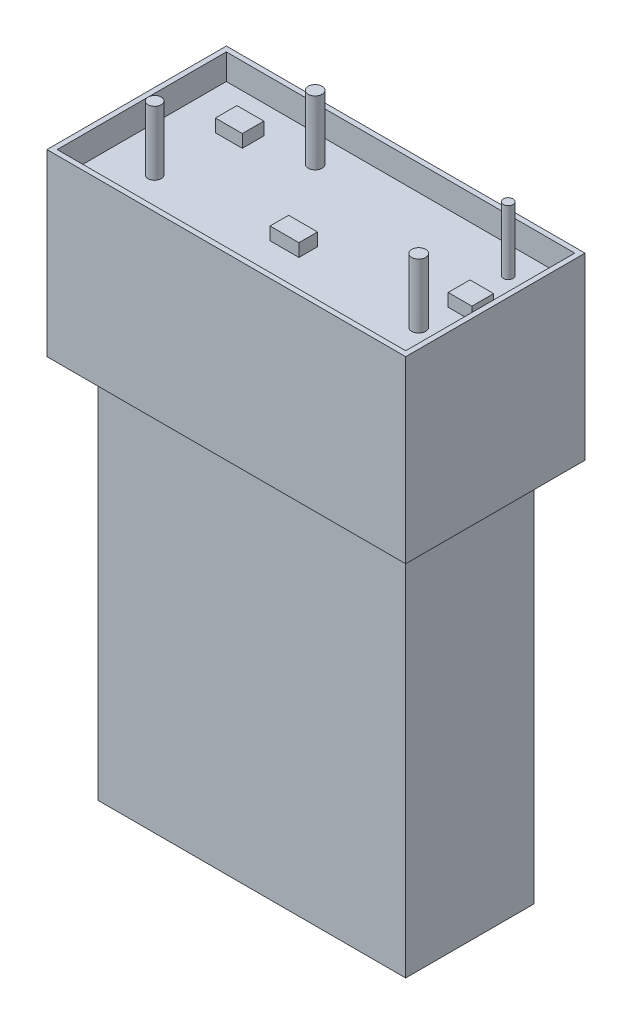
ISO-10303-21;
HEADER;
FILE_DESCRIPTION(('STEP AP214'),'2;1');
FILE_NAME('part.step','',(''),(''),'','','');
FILE_SCHEMA(('AUTOMOTIVE_DESIGN { 1 0 10303 214 1 1 1 1 }'));
ENDSEC;
DATA;
#1=APPLICATION_CONTEXT('core data for automotive mechanical design processes');
#2=APPLICATION_PROTOCOL_DEFINITION('international standard','automotive_design',2000,#1);
#3=PRODUCT_CONTEXT('',#1,'mechanical');
#4=PRODUCT('Part','Part','',(#3));
#5=PRODUCT_RELATED_PRODUCT_CATEGORY('part','',(#4));
#6=PRODUCT_DEFINITION_FORMATION('','',#4);
#7=PRODUCT_DEFINITION_CONTEXT('part definition',#1,'design');
#8=PRODUCT_DEFINITION('design','',#6,#7);
#9=PRODUCT_DEFINITION_SHAPE('','',#8);
#10=(LENGTH_UNIT() NAMED_UNIT(*) SI_UNIT(.MILLI.,.METRE.));
#11=(NAMED_UNIT(*) PLANE_ANGLE_UNIT() SI_UNIT($,.RADIAN.));
#12=(NAMED_UNIT(*) SI_UNIT($,.STERADIAN.) SOLID_ANGLE_UNIT());
#13=UNCERTAINTY_MEASURE_WITH_UNIT(LENGTH_MEASURE(1.E-05),#10,'distance_accuracy_value','');
#14=(GEOMETRIC_REPRESENTATION_CONTEXT(3) GLOBAL_UNCERTAINTY_ASSIGNED_CONTEXT((#13)) GLOBAL_UNIT_ASSIGNED_CONTEXT((#10,
#11,#12)) REPRESENTATION_CONTEXT('',''));
#15=CARTESIAN_POINT('',(0.,0.,0.));
#16=DIRECTION('',(0.,0.,1.));
#17=DIRECTION('',(1.,0.,0.));
#18=AXIS2_PLACEMENT_3D('',#15,#16,#17);
#19=CARTESIAN_POINT('',(0.,21000.,0.));
#20=DIRECTION('',(0.,-1.,0.));
#21=DIRECTION('',(0.,0.,-1.));
#22=AXIS2_PLACEMENT_3D('',#19,#20,#21);
#23=PLANE('',#22);
#24=CARTESIAN_POINT('',(5262.84869807051,21000.,-2238.37319331517));
#25=DIRECTION('',(0.,-1.,0.));
#26=DIRECTION('',(0.,0.,-1.));
#27=AXIS2_PLACEMENT_3D('',#24,#25,#26);
#28=CIRCLE('',#27,190.949540720074);
#29=CARTESIAN_POINT('',(5262.84869807051,21000.,-2429.32273403524));
#30=VERTEX_POINT('',#29);
#31=EDGE_CURVE('E11',#30,#30,#28,.F.);
#32=ORIENTED_EDGE('',*,*,#31,.F.);
#33=EDGE_LOOP('',(#32));
#34=FACE_BOUND('',#33,.T.);
#35=CARTESIAN_POINT('',(-5042.3580880572,21000.,1254.61241268812));
#36=DIRECTION('',(0.,-1.,0.));
#37=DIRECTION('',(0.,0.,-1.));
#38=AXIS2_PLACEMENT_3D('',#35,#36,#37);
#39=CIRCLE('',#38,258.07228782179);
#40=CARTESIAN_POINT('',(-5042.3580880572,21000.,996.540124866329));
#41=VERTEX_POINT('',#40);
#42=EDGE_CURVE('E53',#41,#41,#39,.F.);
#43=ORIENTED_EDGE('',*,*,#42,.F.);
#44=EDGE_LOOP('',(#43));
#45=FACE_BOUND('',#44,.T.);
#46=CARTESIAN_POINT('',(5262.84869807051,21000.,1254.61241268812));
#47=DIRECTION('',(0.,-1.,0.));
#48=DIRECTION('',(0.,0.,-1.));
#49=AXIS2_PLACEMENT_3D('',#46,#47,#48);
#50=CIRCLE('',#49,273.548394489378);
#51=CARTESIAN_POINT('',(5262.84869807051,21000.,981.06401819874));
#52=VERTEX_POINT('',#51);
#53=EDGE_CURVE('E463',#52,#52,#50,.F.);
#54=ORIENTED_EDGE('',*,*,#53,.F.);
#55=EDGE_LOOP('',(#54));
#56=FACE_BOUND('',#55,.T.);
#57=CARTESIAN_POINT('',(-2270.0955849557,21000.,-2238.37319331517));
#58=DIRECTION('',(0.,-1.,0.));
#59=DIRECTION('',(0.,0.,-1.));
#60=AXIS2_PLACEMENT_3D('',#57,#58,#59);
#61=CIRCLE('',#60,271.931197035947);
#62=CARTESIAN_POINT('',(-2270.0955849557,21000.,-2510.30439035112));
#63=VERTEX_POINT('',#62);
#64=EDGE_CURVE('E459',#63,#63,#61,.F.);
#65=ORIENTED_EDGE('',*,*,#64,.F.);
#66=EDGE_LOOP('',(#65));
#67=FACE_BOUND('',#66,.T.);
#68=DIRECTION('',(0.,0.,-1.));
#69=VECTOR('',#68,1.);
#70=CARTESIAN_POINT('',(563.939198015646,21000.,505.063160077611));
#71=LINE('',#70,#69);
#72=CARTESIAN_POINT('',(563.939198015646,21000.,1230.26393452562));
#73=VERTEX_POINT('',#72);
#74=CARTESIAN_POINT('',(563.939198015646,21000.,505.063160077611));
#75=VERTEX_POINT('',#74);
#76=EDGE_CURVE('E230',#73,#75,#71,.T.);
#77=ORIENTED_EDGE('',*,*,#76,.F.);
#78=DIRECTION('',(1.,0.,0.));
#79=VECTOR('',#78,1.);
#80=CARTESIAN_POINT('',(-563.939198015646,21000.,1230.26393452562));
#81=LINE('',#80,#79);
#82=CARTESIAN_POINT('',(-563.939198015646,21000.,1230.26393452562));
#83=VERTEX_POINT('',#82);
#84=EDGE_CURVE('E248',#83,#73,#81,.T.);
#85=ORIENTED_EDGE('',*,*,#84,.F.);
#86=DIRECTION('',(0.,0.,1.));
#87=VECTOR('',#86,1.);
#88=CARTESIAN_POINT('',(-563.939198015646,21000.,505.063160077611));
#89=LINE('',#88,#87);
#90=CARTESIAN_POINT('',(-563.939198015646,21000.,505.063160077611));
#91=VERTEX_POINT('',#90);
#92=EDGE_CURVE('E261',#91,#83,#89,.T.);
#93=ORIENTED_EDGE('',*,*,#92,.F.);
#94=DIRECTION('',(-1.,0.,0.));
#95=VECTOR('',#94,1.);
#96=CARTESIAN_POINT('',(-563.939198015646,21000.,505.063160077611));
#97=LINE('',#96,#95);
#98=EDGE_CURVE('E236',#75,#91,#97,.T.);
#99=ORIENTED_EDGE('',*,*,#98,.F.);
#100=EDGE_LOOP('',(#77,#85,#93,#99));
#101=FACE_BOUND('',#100,.T.);
#102=DIRECTION('',(0.,0.,1.));
#103=VECTOR('',#102,1.);
#104=CARTESIAN_POINT('',(-6800.,21000.,-3300.));
#105=LINE('',#104,#103);
#106=CARTESIAN_POINT('',(-6800.,21000.,-3300.));
#107=VERTEX_POINT('',#106);
#108=CARTESIAN_POINT('',(-6800.,21000.,3300.));
#109=VERTEX_POINT('',#108);
#110=EDGE_CURVE('E332',#107,#109,#105,.T.);
#111=ORIENTED_EDGE('',*,*,#110,.T.);
#112=DIRECTION('',(1.,0.,0.));
#113=VECTOR('',#112,1.);
#114=CARTESIAN_POINT('',(-6800.,21000.,3300.));
#115=LINE('',#114,#113);
#116=CARTESIAN_POINT('',(6800.,21000.,3300.));
#117=VERTEX_POINT('',#116);
#118=EDGE_CURVE('E327',#109,#117,#115,.T.);
#119=ORIENTED_EDGE('',*,*,#118,.T.);
#120=DIRECTION('',(0.,0.,-1.));
#121=VECTOR('',#120,1.);
#122=CARTESIAN_POINT('',(6800.,21000.,3300.));
#123=LINE('',#122,#121);
#124=CARTESIAN_POINT('',(6800.,21000.,-3300.));
#125=VERTEX_POINT('',#124);
#126=EDGE_CURVE('E346',#117,#125,#123,.T.);
#127=ORIENTED_EDGE('',*,*,#126,.T.);
#128=DIRECTION('',(-1.,0.,0.));
#129=VECTOR('',#128,1.);
#130=CARTESIAN_POINT('',(6800.,21000.,-3300.));
#131=LINE('',#130,#129);
#132=EDGE_CURVE('E350',#125,#107,#131,.T.);
#133=ORIENTED_EDGE('',*,*,#132,.T.);
#134=EDGE_LOOP('',(#111,#119,#127,#133));
#135=FACE_BOUND('',#134,.T.);
#136=DIRECTION('',(0.,0.,-1.));
#137=VECTOR('',#136,1.);
#138=CARTESIAN_POINT('',(-4229.1920789657,21000.,-1353.44284093981));
#139=LINE('',#138,#137);
#140=CARTESIAN_POINT('',(-4229.1920789657,21000.,-1353.44284093981));
#141=VERTEX_POINT('',#140);
#142=CARTESIAN_POINT('',(-4229.1920789657,21000.,-2193.66277148333));
#143=VERTEX_POINT('',#142);
#144=EDGE_CURVE('E283',#141,#143,#139,.T.);
#145=ORIENTED_EDGE('',*,*,#144,.F.);
#146=DIRECTION('',(1.,0.,0.));
#147=VECTOR('',#146,1.);
#148=CARTESIAN_POINT('',(-5279.16117752801,21000.,-1353.44284093981));
#149=LINE('',#148,#147);
#150=CARTESIAN_POINT('',(-5279.16117752801,21000.,-1353.44284093981));
#151=VERTEX_POINT('',#150);
#152=EDGE_CURVE('E289',#151,#141,#149,.T.);
#153=ORIENTED_EDGE('',*,*,#152,.F.);
#154=DIRECTION('',(0.,0.,1.));
#155=VECTOR('',#154,1.);
#156=CARTESIAN_POINT('',(-5279.16117752801,21000.,-1353.44284093981));
#157=LINE('',#156,#155);
#158=CARTESIAN_POINT('',(-5279.16117752801,21000.,-2193.66277148333));
#159=VERTEX_POINT('',#158);
#160=EDGE_CURVE('E305',#159,#151,#157,.T.);
#161=ORIENTED_EDGE('',*,*,#160,.F.);
#162=DIRECTION('',(-1.,0.,0.));
#163=VECTOR('',#162,1.);
#164=CARTESIAN_POINT('',(-5279.16117752801,21000.,-2193.66277148333));
#165=LINE('',#164,#163);
#166=EDGE_CURVE('E301',#143,#159,#165,.T.);
#167=ORIENTED_EDGE('',*,*,#166,.F.);
#168=EDGE_LOOP('',(#145,#153,#161,#167));
#169=FACE_BOUND('',#168,.T.);
#170=DIRECTION('',(0.,0.,-1.));
#171=VECTOR('',#170,1.);
#172=CARTESIAN_POINT('',(6083.93766020623,21000.,-848.717356223801));
#173=LINE('',#172,#171);
#174=CARTESIAN_POINT('',(6083.93766020623,21000.,0.));
#175=VERTEX_POINT('',#174);
#176=CARTESIAN_POINT('',(6083.93766020623,21000.,-848.717356223801));
#177=VERTEX_POINT('',#176);
#178=EDGE_CURVE('E228',#175,#177,#173,.T.);
#179=ORIENTED_EDGE('',*,*,#178,.F.);
#180=DIRECTION('',(1.,0.,0.));
#181=VECTOR('',#180,1.);
#182=CARTESIAN_POINT('',(5159.11003284151,21000.,0.));
#183=LINE('',#182,#181);
#184=CARTESIAN_POINT('',(5159.11003284151,21000.,0.));
#185=VERTEX_POINT('',#184);
#186=EDGE_CURVE('E225',#185,#175,#183,.T.);
#187=ORIENTED_EDGE('',*,*,#186,.F.);
#188=DIRECTION('',(0.,0.,1.));
#189=VECTOR('',#188,1.);
#190=CARTESIAN_POINT('',(5159.11003284151,21000.,-848.717356223801));
#191=LINE('',#190,#189);
#192=CARTESIAN_POINT('',(5159.11003284151,21000.,-848.717356223801));
#193=VERTEX_POINT('',#192);
#194=EDGE_CURVE('E65',#193,#185,#191,.T.);
#195=ORIENTED_EDGE('',*,*,#194,.F.);
#196=DIRECTION('',(-1.,0.,0.));
#197=VECTOR('',#196,1.);
#198=CARTESIAN_POINT('',(5159.11003284151,21000.,-848.717356223801));
#199=LINE('',#198,#197);
#200=EDGE_CURVE('E60',#177,#193,#199,.T.);
#201=ORIENTED_EDGE('',*,*,#200,.F.);
#202=EDGE_LOOP('',(#179,#187,#195,#201));
#203=FACE_BOUND('',#202,.T.);
#204=ADVANCED_FACE('F44',(#34,#45,#56,#67,#101,#135,#169,#203),#23,.F.);
#205=CARTESIAN_POINT('',(6000.,15000.,2500.));
#206=DIRECTION('',(-1.,0.,0.));
#207=DIRECTION('',(0.,0.,1.));
#208=AXIS2_PLACEMENT_3D('',#205,#206,#207);
#209=PLANE('',#208);
#210=DIRECTION('',(0.,0.,-1.));
#211=VECTOR('',#210,1.);
#212=CARTESIAN_POINT('',(6000.,0.,2500.));
#213=LINE('',#212,#211);
#214=CARTESIAN_POINT('',(6000.,0.,2500.));
#215=VERTEX_POINT('',#214);
#216=CARTESIAN_POINT('',(6000.,0.,-2500.));
#217=VERTEX_POINT('',#216);
#218=EDGE_CURVE('E414',#215,#217,#213,.T.);
#219=ORIENTED_EDGE('',*,*,#218,.T.);
#220=DIRECTION('',(0.,-1.,0.));
#221=VECTOR('',#220,1.);
#222=CARTESIAN_POINT('',(6000.,15000.,-2500.));
#223=LINE('',#222,#221);
#224=CARTESIAN_POINT('',(6000.,15000.,-2500.));
#225=VERTEX_POINT('',#224);
#226=EDGE_CURVE('E455',#225,#217,#223,.T.);
#227=ORIENTED_EDGE('',*,*,#226,.F.);
#228=DIRECTION('',(0.,0.,-1.));
#229=VECTOR('',#228,1.);
#230=CARTESIAN_POINT('',(6000.,15000.,2500.));
#231=LINE('',#230,#229);
#232=CARTESIAN_POINT('',(6000.,15000.,2500.));
#233=VERTEX_POINT('',#232);
#234=EDGE_CURVE('E415',#233,#225,#231,.T.);
#235=ORIENTED_EDGE('',*,*,#234,.F.);
#236=DIRECTION('',(0.,-1.,0.));
#237=VECTOR('',#236,1.);
#238=CARTESIAN_POINT('',(6000.,15000.,2500.));
#239=LINE('',#238,#237);
#240=EDGE_CURVE('E432',#233,#215,#239,.T.);
#241=ORIENTED_EDGE('',*,*,#240,.T.);
#242=EDGE_LOOP('',(#219,#227,#235,#241));
#243=FACE_BOUND('',#242,.T.);
#244=ADVANCED_FACE('F46',(#243),#209,.F.);
#245=CARTESIAN_POINT('',(-6000.,15000.,-2500.));
#246=DIRECTION('',(0.,0.,1.));
#247=DIRECTION('',(1.,0.,0.));
#248=AXIS2_PLACEMENT_3D('',#245,#246,#247);
#249=PLANE('',#248);
#250=DIRECTION('',(-1.,0.,0.));
#251=VECTOR('',#250,1.);
#252=CARTESIAN_POINT('',(-6000.,0.,-2500.));
#253=LINE('',#252,#251);
#254=CARTESIAN_POINT('',(-6000.,0.,-2500.));
#255=VERTEX_POINT('',#254);
#256=EDGE_CURVE('E436',#217,#255,#253,.T.);
#257=ORIENTED_EDGE('',*,*,#256,.T.);
#258=DIRECTION('',(0.,-1.,0.));
#259=VECTOR('',#258,1.);
#260=CARTESIAN_POINT('',(-6000.,15000.,-2500.));
#261=LINE('',#260,#259);
#262=CARTESIAN_POINT('',(-6000.,15000.,-2500.));
#263=VERTEX_POINT('',#262);
#264=EDGE_CURVE('E451',#263,#255,#261,.T.);
#265=ORIENTED_EDGE('',*,*,#264,.F.);
#266=DIRECTION('',(-1.,0.,0.));
#267=VECTOR('',#266,1.);
#268=CARTESIAN_POINT('',(-6000.,15000.,-2500.));
#269=LINE('',#268,#267);
#270=EDGE_CURVE('E419',#225,#263,#269,.T.);
#271=ORIENTED_EDGE('',*,*,#270,.F.);
#272=ORIENTED_EDGE('',*,*,#226,.T.);
#273=EDGE_LOOP('',(#257,#265,#271,#272));
#274=FACE_BOUND('',#273,.T.);
#275=ADVANCED_FACE('F658',(#274),#249,.F.);
#276=CARTESIAN_POINT('',(-6000.,15000.,2500.));
#277=DIRECTION('',(1.,0.,0.));
#278=DIRECTION('',(0.,0.,-1.));
#279=AXIS2_PLACEMENT_3D('',#276,#277,#278);
#280=PLANE('',#279);
#281=DIRECTION('',(0.,0.,1.));
#282=VECTOR('',#281,1.);
#283=CARTESIAN_POINT('',(-6000.,0.,2500.));
#284=LINE('',#283,#282);
#285=CARTESIAN_POINT('',(-6000.,0.,2500.));
#286=VERTEX_POINT('',#285);
#287=EDGE_CURVE('E439',#255,#286,#284,.T.);
#288=ORIENTED_EDGE('',*,*,#287,.T.);
#289=DIRECTION('',(0.,-1.,0.));
#290=VECTOR('',#289,1.);
#291=CARTESIAN_POINT('',(-6000.,15000.,2500.));
#292=LINE('',#291,#290);
#293=CARTESIAN_POINT('',(-6000.,15000.,2500.));
#294=VERTEX_POINT('',#293);
#295=EDGE_CURVE('E447',#294,#286,#292,.T.);
#296=ORIENTED_EDGE('',*,*,#295,.F.);
#297=DIRECTION('',(0.,0.,1.));
#298=VECTOR('',#297,1.);
#299=CARTESIAN_POINT('',(-6000.,15000.,2500.));
#300=LINE('',#299,#298);
#301=EDGE_CURVE('E424',#263,#294,#300,.T.);
#302=ORIENTED_EDGE('',*,*,#301,.F.);
#303=ORIENTED_EDGE('',*,*,#264,.T.);
#304=EDGE_LOOP('',(#288,#296,#302,#303));
#305=FACE_BOUND('',#304,.T.);
#306=ADVANCED_FACE('F655',(#305),#280,.F.);
#307=CARTESIAN_POINT('',(-6000.,15000.,2500.));
#308=DIRECTION('',(0.,0.,-1.));
#309=DIRECTION('',(-1.,0.,0.));
#310=AXIS2_PLACEMENT_3D('',#307,#308,#309);
#311=PLANE('',#310);
#312=DIRECTION('',(1.,0.,0.));
#313=VECTOR('',#312,1.);
#314=CARTESIAN_POINT('',(-6000.,0.,2500.));
#315=LINE('',#314,#313);
#316=EDGE_CURVE('E420',#286,#215,#315,.T.);
#317=ORIENTED_EDGE('',*,*,#316,.T.);
#318=ORIENTED_EDGE('',*,*,#240,.F.);
#319=DIRECTION('',(1.,0.,0.));
#320=VECTOR('',#319,1.);
#321=CARTESIAN_POINT('',(-6000.,15000.,2500.));
#322=LINE('',#321,#320);
#323=EDGE_CURVE('E428',#294,#233,#322,.T.);
#324=ORIENTED_EDGE('',*,*,#323,.F.);
#325=ORIENTED_EDGE('',*,*,#295,.T.);
#326=EDGE_LOOP('',(#317,#318,#324,#325));
#327=FACE_BOUND('',#326,.T.);
#328=ADVANCED_FACE('F651',(#327),#311,.F.);
#329=CARTESIAN_POINT('',(0.,0.,0.));
#330=DIRECTION('',(0.,-1.,0.));
#331=DIRECTION('',(0.,0.,-1.));
#332=AXIS2_PLACEMENT_3D('',#329,#330,#331);
#333=PLANE('',#332);
#334=ORIENTED_EDGE('',*,*,#218,.F.);
#335=ORIENTED_EDGE('',*,*,#316,.F.);
#336=ORIENTED_EDGE('',*,*,#287,.F.);
#337=ORIENTED_EDGE('',*,*,#256,.F.);
#338=EDGE_LOOP('',(#334,#335,#336,#337));
#339=FACE_BOUND('',#338,.T.);
#340=ADVANCED_FACE('F647',(#339),#333,.T.);
#341=CARTESIAN_POINT('',(7000.,21000.,3500.));
#342=DIRECTION('',(-1.,0.,0.));
#343=DIRECTION('',(0.,0.,1.));
#344=AXIS2_PLACEMENT_3D('',#341,#342,#343);
#345=PLANE('',#344);
#346=DIRECTION('',(0.,0.,-1.));
#347=VECTOR('',#346,1.);
#348=CARTESIAN_POINT('',(7000.,15000.,3500.));
#349=LINE('',#348,#347);
#350=CARTESIAN_POINT('',(7000.,15000.,3500.));
#351=VERTEX_POINT('',#350);
#352=CARTESIAN_POINT('',(7000.,15000.,-3500.));
#353=VERTEX_POINT('',#352);
#354=EDGE_CURVE('E385',#351,#353,#349,.T.);
#355=ORIENTED_EDGE('',*,*,#354,.T.);
#356=DIRECTION('',(0.,-1.,0.));
#357=VECTOR('',#356,1.);
#358=CARTESIAN_POINT('',(7000.,21000.,-3500.));
#359=LINE('',#358,#357);
#360=CARTESIAN_POINT('',(7000.,22000.,-3500.));
#361=VERTEX_POINT('',#360);
#362=EDGE_CURVE('E410',#361,#353,#359,.T.);
#363=ORIENTED_EDGE('',*,*,#362,.F.);
#364=DIRECTION('',(0.,0.,-1.));
#365=VECTOR('',#364,1.);
#366=CARTESIAN_POINT('',(7000.,22000.,3500.));
#367=LINE('',#366,#365);
#368=CARTESIAN_POINT('',(7000.,22000.,3500.));
#369=VERTEX_POINT('',#368);
#370=EDGE_CURVE('E373',#369,#361,#367,.T.);
#371=ORIENTED_EDGE('',*,*,#370,.F.);
#372=DIRECTION('',(0.,-1.,0.));
#373=VECTOR('',#372,1.);
#374=CARTESIAN_POINT('',(7000.,21000.,3500.));
#375=LINE('',#374,#373);
#376=EDGE_CURVE('E398',#369,#351,#375,.T.);
#377=ORIENTED_EDGE('',*,*,#376,.T.);
#378=EDGE_LOOP('',(#355,#363,#371,#377));
#379=FACE_BOUND('',#378,.T.);
#380=ADVANCED_FACE('F643',(#379),#345,.F.);
#381=CARTESIAN_POINT('',(-7000.,21000.,-3500.));
#382=DIRECTION('',(0.,0.,1.));
#383=DIRECTION('',(1.,0.,0.));
#384=AXIS2_PLACEMENT_3D('',#381,#382,#383);
#385=PLANE('',#384);
#386=DIRECTION('',(-1.,0.,0.));
#387=VECTOR('',#386,1.);
#388=CARTESIAN_POINT('',(-7000.,15000.,-3500.));
#389=LINE('',#388,#387);
#390=CARTESIAN_POINT('',(-7000.,15000.,-3500.));
#391=VERTEX_POINT('',#390);
#392=EDGE_CURVE('E389',#353,#391,#389,.T.);
#393=ORIENTED_EDGE('',*,*,#392,.T.);
#394=DIRECTION('',(0.,-1.,0.));
#395=VECTOR('',#394,1.);
#396=CARTESIAN_POINT('',(-7000.,21000.,-3500.));
#397=LINE('',#396,#395);
#398=CARTESIAN_POINT('',(-7000.,22000.,-3500.));
#399=VERTEX_POINT('',#398);
#400=EDGE_CURVE('E406',#399,#391,#397,.T.);
#401=ORIENTED_EDGE('',*,*,#400,.F.);
#402=DIRECTION('',(-1.,0.,0.));
#403=VECTOR('',#402,1.);
#404=CARTESIAN_POINT('',(7000.,22000.,-3500.));
#405=LINE('',#404,#403);
#406=EDGE_CURVE('E377',#361,#399,#405,.T.);
#407=ORIENTED_EDGE('',*,*,#406,.F.);
#408=ORIENTED_EDGE('',*,*,#362,.T.);
#409=EDGE_LOOP('',(#393,#401,#407,#408));
#410=FACE_BOUND('',#409,.T.);
#411=ADVANCED_FACE('F639',(#410),#385,.F.);
#412=CARTESIAN_POINT('',(-7000.,21000.,3500.));
#413=DIRECTION('',(1.,0.,0.));
#414=DIRECTION('',(0.,0.,-1.));
#415=AXIS2_PLACEMENT_3D('',#412,#413,#414);
#416=PLANE('',#415);
#417=DIRECTION('',(0.,0.,1.));
#418=VECTOR('',#417,1.);
#419=CARTESIAN_POINT('',(-7000.,15000.,3500.));
#420=LINE('',#419,#418);
#421=CARTESIAN_POINT('',(-7000.,15000.,3500.));
#422=VERTEX_POINT('',#421);
#423=EDGE_CURVE('E392',#391,#422,#420,.T.);
#424=ORIENTED_EDGE('',*,*,#423,.T.);
#425=DIRECTION('',(0.,-1.,0.));
#426=VECTOR('',#425,1.);
#427=CARTESIAN_POINT('',(-7000.,21000.,3500.));
#428=LINE('',#427,#426);
#429=CARTESIAN_POINT('',(-7000.,22000.,3500.));
#430=VERTEX_POINT('',#429);
#431=EDGE_CURVE('E402',#430,#422,#428,.T.);
#432=ORIENTED_EDGE('',*,*,#431,.F.);
#433=DIRECTION('',(0.,0.,1.));
#434=VECTOR('',#433,1.);
#435=CARTESIAN_POINT('',(-7000.,22000.,-3500.));
#436=LINE('',#435,#434);
#437=EDGE_CURVE('E381',#399,#430,#436,.T.);
#438=ORIENTED_EDGE('',*,*,#437,.F.);
#439=ORIENTED_EDGE('',*,*,#400,.T.);
#440=EDGE_LOOP('',(#424,#432,#438,#439));
#441=FACE_BOUND('',#440,.T.);
#442=ADVANCED_FACE('F635',(#441),#416,.F.);
#443=CARTESIAN_POINT('',(-7000.,21000.,3500.));
#444=DIRECTION('',(0.,0.,-1.));
#445=DIRECTION('',(-1.,0.,0.));
#446=AXIS2_PLACEMENT_3D('',#443,#444,#445);
#447=PLANE('',#446);
#448=DIRECTION('',(1.,0.,0.));
#449=VECTOR('',#448,1.);
#450=CARTESIAN_POINT('',(-7000.,15000.,3500.));
#451=LINE('',#450,#449);
#452=EDGE_CURVE('E395',#422,#351,#451,.T.);
#453=ORIENTED_EDGE('',*,*,#452,.T.);
#454=ORIENTED_EDGE('',*,*,#376,.F.);
#455=DIRECTION('',(1.,0.,0.));
#456=VECTOR('',#455,1.);
#457=CARTESIAN_POINT('',(-7000.,22000.,3500.));
#458=LINE('',#457,#456);
#459=EDGE_CURVE('E369',#430,#369,#458,.T.);
#460=ORIENTED_EDGE('',*,*,#459,.F.);
#461=ORIENTED_EDGE('',*,*,#431,.T.);
#462=EDGE_LOOP('',(#453,#454,#460,#461));
#463=FACE_BOUND('',#462,.T.);
#464=ADVANCED_FACE('F631',(#463),#447,.F.);
#465=CARTESIAN_POINT('',(0.,15000.,0.));
#466=DIRECTION('',(0.,-1.,0.));
#467=DIRECTION('',(0.,0.,-1.));
#468=AXIS2_PLACEMENT_3D('',#465,#466,#467);
#469=PLANE('',#468);
#470=ORIENTED_EDGE('',*,*,#323,.T.);
#471=ORIENTED_EDGE('',*,*,#234,.T.);
#472=ORIENTED_EDGE('',*,*,#270,.T.);
#473=ORIENTED_EDGE('',*,*,#301,.T.);
#474=EDGE_LOOP('',(#470,#471,#472,#473));
#475=FACE_BOUND('',#474,.T.);
#476=ORIENTED_EDGE('',*,*,#354,.F.);
#477=ORIENTED_EDGE('',*,*,#452,.F.);
#478=ORIENTED_EDGE('',*,*,#423,.F.);
#479=ORIENTED_EDGE('',*,*,#392,.F.);
#480=EDGE_LOOP('',(#476,#477,#478,#479));
#481=FACE_BOUND('',#480,.T.);
#482=ADVANCED_FACE('F626',(#475,#481),#469,.T.);
#483=CARTESIAN_POINT('',(0.,22000.,0.));
#484=DIRECTION('',(0.,1.,0.));
#485=DIRECTION('',(0.,0.,1.));
#486=AXIS2_PLACEMENT_3D('',#483,#484,#485);
#487=PLANE('',#486);
#488=ORIENTED_EDGE('',*,*,#459,.T.);
#489=ORIENTED_EDGE('',*,*,#370,.T.);
#490=ORIENTED_EDGE('',*,*,#406,.T.);
#491=ORIENTED_EDGE('',*,*,#437,.T.);
#492=EDGE_LOOP('',(#488,#489,#490,#491));
#493=FACE_BOUND('',#492,.T.);
#494=DIRECTION('',(0.,0.,-1.));
#495=VECTOR('',#494,1.);
#496=CARTESIAN_POINT('',(6800.,22000.,3300.));
#497=LINE('',#496,#495);
#498=CARTESIAN_POINT('',(6800.,22000.,3300.));
#499=VERTEX_POINT('',#498);
#500=CARTESIAN_POINT('',(6800.,22000.,-3300.));
#501=VERTEX_POINT('',#500);
#502=EDGE_CURVE('E331',#499,#501,#497,.T.);
#503=ORIENTED_EDGE('',*,*,#502,.F.);
#504=DIRECTION('',(1.,0.,0.));
#505=VECTOR('',#504,1.);
#506=CARTESIAN_POINT('',(-6800.,22000.,3300.));
#507=LINE('',#506,#505);
#508=CARTESIAN_POINT('',(-6800.,22000.,3300.));
#509=VERTEX_POINT('',#508);
#510=EDGE_CURVE('E328',#509,#499,#507,.T.);
#511=ORIENTED_EDGE('',*,*,#510,.F.);
#512=DIRECTION('',(0.,0.,1.));
#513=VECTOR('',#512,1.);
#514=CARTESIAN_POINT('',(-6800.,22000.,-3300.));
#515=LINE('',#514,#513);
#516=CARTESIAN_POINT('',(-6800.,22000.,-3300.));
#517=VERTEX_POINT('',#516);
#518=EDGE_CURVE('E339',#517,#509,#515,.T.);
#519=ORIENTED_EDGE('',*,*,#518,.F.);
#520=DIRECTION('',(-1.,0.,0.));
#521=VECTOR('',#520,1.);
#522=CARTESIAN_POINT('',(6800.,22000.,-3300.));
#523=LINE('',#522,#521);
#524=EDGE_CURVE('E335',#501,#517,#523,.T.);
#525=ORIENTED_EDGE('',*,*,#524,.F.);
#526=EDGE_LOOP('',(#503,#511,#519,#525));
#527=FACE_BOUND('',#526,.T.);
#528=ADVANCED_FACE('F623',(#493,#527),#487,.T.);
#529=CARTESIAN_POINT('',(-6800.,22000.,3300.));
#530=DIRECTION('',(0.,0.,-1.));
#531=DIRECTION('',(-1.,0.,0.));
#532=AXIS2_PLACEMENT_3D('',#529,#530,#531);
#533=PLANE('',#532);
#534=ORIENTED_EDGE('',*,*,#118,.F.);
#535=DIRECTION('',(0.,-1.,0.));
#536=VECTOR('',#535,1.);
#537=CARTESIAN_POINT('',(-6800.,22000.,3300.));
#538=LINE('',#537,#536);
#539=EDGE_CURVE('E342',#509,#109,#538,.T.);
#540=ORIENTED_EDGE('',*,*,#539,.F.);
#541=ORIENTED_EDGE('',*,*,#510,.T.);
#542=DIRECTION('',(0.,-1.,0.));
#543=VECTOR('',#542,1.);
#544=CARTESIAN_POINT('',(6800.,22000.,3300.));
#545=LINE('',#544,#543);
#546=EDGE_CURVE('E365',#499,#117,#545,.T.);
#547=ORIENTED_EDGE('',*,*,#546,.T.);
#548=EDGE_LOOP('',(#534,#540,#541,#547));
#549=FACE_BOUND('',#548,.T.);
#550=ADVANCED_FACE('F619',(#549),#533,.T.);
#551=CARTESIAN_POINT('',(6800.,22000.,3300.));
#552=DIRECTION('',(-1.,0.,0.));
#553=DIRECTION('',(0.,0.,1.));
#554=AXIS2_PLACEMENT_3D('',#551,#552,#553);
#555=PLANE('',#554);
#556=ORIENTED_EDGE('',*,*,#126,.F.);
#557=ORIENTED_EDGE('',*,*,#546,.F.);
#558=ORIENTED_EDGE('',*,*,#502,.T.);
#559=DIRECTION('',(0.,-1.,0.));
#560=VECTOR('',#559,1.);
#561=CARTESIAN_POINT('',(6800.,22000.,-3300.));
#562=LINE('',#561,#560);
#563=EDGE_CURVE('E362',#501,#125,#562,.T.);
#564=ORIENTED_EDGE('',*,*,#563,.T.);
#565=EDGE_LOOP('',(#556,#557,#558,#564));
#566=FACE_BOUND('',#565,.T.);
#567=ADVANCED_FACE('F615',(#566),#555,.T.);
#568=CARTESIAN_POINT('',(6800.,22000.,-3300.));
#569=DIRECTION('',(0.,0.,1.));
#570=DIRECTION('',(1.,0.,0.));
#571=AXIS2_PLACEMENT_3D('',#568,#569,#570);
#572=PLANE('',#571);
#573=ORIENTED_EDGE('',*,*,#132,.F.);
#574=ORIENTED_EDGE('',*,*,#563,.F.);
#575=ORIENTED_EDGE('',*,*,#524,.T.);
#576=DIRECTION('',(0.,-1.,0.));
#577=VECTOR('',#576,1.);
#578=CARTESIAN_POINT('',(-6800.,22000.,-3300.));
#579=LINE('',#578,#577);
#580=EDGE_CURVE('E359',#517,#107,#579,.T.);
#581=ORIENTED_EDGE('',*,*,#580,.T.);
#582=EDGE_LOOP('',(#573,#574,#575,#581));
#583=FACE_BOUND('',#582,.T.);
#584=ADVANCED_FACE('F611',(#583),#572,.T.);
#585=CARTESIAN_POINT('',(-6800.,22000.,-3300.));
#586=DIRECTION('',(1.,0.,0.));
#587=DIRECTION('',(0.,0.,-1.));
#588=AXIS2_PLACEMENT_3D('',#585,#586,#587);
#589=PLANE('',#588);
#590=ORIENTED_EDGE('',*,*,#110,.F.);
#591=ORIENTED_EDGE('',*,*,#580,.F.);
#592=ORIENTED_EDGE('',*,*,#518,.T.);
#593=ORIENTED_EDGE('',*,*,#539,.T.);
#594=EDGE_LOOP('',(#590,#591,#592,#593));
#595=FACE_BOUND('',#594,.T.);
#596=ADVANCED_FACE('F607',(#595),#589,.T.);
#597=CARTESIAN_POINT('',(-4229.1920789657,21500.,-1353.44284093981));
#598=DIRECTION('',(-1.,0.,0.));
#599=DIRECTION('',(0.,0.,1.));
#600=AXIS2_PLACEMENT_3D('',#597,#598,#599);
#601=PLANE('',#600);
#602=ORIENTED_EDGE('',*,*,#144,.T.);
#603=DIRECTION('',(0.,-1.,0.));
#604=VECTOR('',#603,1.);
#605=CARTESIAN_POINT('',(-4229.1920789657,21500.,-2193.66277148333));
#606=LINE('',#605,#604);
#607=CARTESIAN_POINT('',(-4229.1920789657,21500.,-2193.66277148333));
#608=VERTEX_POINT('',#607);
#609=EDGE_CURVE('E323',#608,#143,#606,.T.);
#610=ORIENTED_EDGE('',*,*,#609,.F.);
#611=DIRECTION('',(0.,0.,-1.));
#612=VECTOR('',#611,1.);
#613=CARTESIAN_POINT('',(-4229.1920789657,21500.,-1353.44284093981));
#614=LINE('',#613,#612);
#615=CARTESIAN_POINT('',(-4229.1920789657,21500.,-1353.44284093981));
#616=VERTEX_POINT('',#615);
#617=EDGE_CURVE('E284',#616,#608,#614,.T.);
#618=ORIENTED_EDGE('',*,*,#617,.F.);
#619=DIRECTION('',(0.,-1.,0.));
#620=VECTOR('',#619,1.);
#621=CARTESIAN_POINT('',(-4229.1920789657,21500.,-1353.44284093981));
#622=LINE('',#621,#620);
#623=EDGE_CURVE('E297',#616,#141,#622,.T.);
#624=ORIENTED_EDGE('',*,*,#623,.T.);
#625=EDGE_LOOP('',(#602,#610,#618,#624));
#626=FACE_BOUND('',#625,.T.);
#627=ADVANCED_FACE('F603',(#626),#601,.F.);
#628=CARTESIAN_POINT('',(-5279.16117752801,21500.,-2193.66277148333));
#629=DIRECTION('',(0.,0.,1.));
#630=DIRECTION('',(1.,0.,0.));
#631=AXIS2_PLACEMENT_3D('',#628,#629,#630);
#632=PLANE('',#631);
#633=ORIENTED_EDGE('',*,*,#166,.T.);
#634=DIRECTION('',(0.,-1.,0.));
#635=VECTOR('',#634,1.);
#636=CARTESIAN_POINT('',(-5279.16117752801,21500.,-2193.66277148333));
#637=LINE('',#636,#635);
#638=CARTESIAN_POINT('',(-5279.16117752801,21500.,-2193.66277148333));
#639=VERTEX_POINT('',#638);
#640=EDGE_CURVE('E319',#639,#159,#637,.T.);
#641=ORIENTED_EDGE('',*,*,#640,.F.);
#642=DIRECTION('',(-1.,0.,0.));
#643=VECTOR('',#642,1.);
#644=CARTESIAN_POINT('',(-5279.16117752801,21500.,-2193.66277148333));
#645=LINE('',#644,#643);
#646=EDGE_CURVE('E288',#608,#639,#645,.T.);
#647=ORIENTED_EDGE('',*,*,#646,.F.);
#648=ORIENTED_EDGE('',*,*,#609,.T.);
#649=EDGE_LOOP('',(#633,#641,#647,#648));
#650=FACE_BOUND('',#649,.T.);
#651=ADVANCED_FACE('F599',(#650),#632,.F.);
#652=CARTESIAN_POINT('',(-5279.16117752801,21500.,-1353.44284093981));
#653=DIRECTION('',(1.,0.,0.));
#654=DIRECTION('',(0.,0.,-1.));
#655=AXIS2_PLACEMENT_3D('',#652,#653,#654);
#656=PLANE('',#655);
#657=ORIENTED_EDGE('',*,*,#160,.T.);
#658=DIRECTION('',(0.,-1.,0.));
#659=VECTOR('',#658,1.);
#660=CARTESIAN_POINT('',(-5279.16117752801,21500.,-1353.44284093981));
#661=LINE('',#660,#659);
#662=CARTESIAN_POINT('',(-5279.16117752801,21500.,-1353.44284093981));
#663=VERTEX_POINT('',#662);
#664=EDGE_CURVE('E315',#663,#151,#661,.T.);
#665=ORIENTED_EDGE('',*,*,#664,.F.);
#666=DIRECTION('',(0.,0.,1.));
#667=VECTOR('',#666,1.);
#668=CARTESIAN_POINT('',(-5279.16117752801,21500.,-1353.44284093981));
#669=LINE('',#668,#667);
#670=EDGE_CURVE('E292',#639,#663,#669,.T.);
#671=ORIENTED_EDGE('',*,*,#670,.F.);
#672=ORIENTED_EDGE('',*,*,#640,.T.);
#673=EDGE_LOOP('',(#657,#665,#671,#672));
#674=FACE_BOUND('',#673,.T.);
#675=ADVANCED_FACE('F595',(#674),#656,.F.);
#676=CARTESIAN_POINT('',(-5279.16117752801,21500.,-1353.44284093981));
#677=DIRECTION('',(0.,0.,-1.));
#678=DIRECTION('',(-1.,0.,0.));
#679=AXIS2_PLACEMENT_3D('',#676,#677,#678);
#680=PLANE('',#679);
#681=ORIENTED_EDGE('',*,*,#152,.T.);
#682=ORIENTED_EDGE('',*,*,#623,.F.);
#683=DIRECTION('',(1.,0.,0.));
#684=VECTOR('',#683,1.);
#685=CARTESIAN_POINT('',(-5279.16117752801,21500.,-1353.44284093981));
#686=LINE('',#685,#684);
#687=EDGE_CURVE('E294',#663,#616,#686,.T.);
#688=ORIENTED_EDGE('',*,*,#687,.F.);
#689=ORIENTED_EDGE('',*,*,#664,.T.);
#690=EDGE_LOOP('',(#681,#682,#688,#689));
#691=FACE_BOUND('',#690,.T.);
#692=ADVANCED_FACE('F591',(#691),#680,.F.);
#693=CARTESIAN_POINT('',(0.,21500.,0.));
#694=DIRECTION('',(0.,-1.,0.));
#695=DIRECTION('',(0.,0.,-1.));
#696=AXIS2_PLACEMENT_3D('',#693,#694,#695);
#697=PLANE('',#696);
#698=ORIENTED_EDGE('',*,*,#617,.T.);
#699=ORIENTED_EDGE('',*,*,#646,.T.);
#700=ORIENTED_EDGE('',*,*,#670,.T.);
#701=ORIENTED_EDGE('',*,*,#687,.T.);
#702=EDGE_LOOP('',(#698,#699,#700,#701));
#703=FACE_BOUND('',#702,.T.);
#704=ADVANCED_FACE('F587',(#703),#697,.F.);
#705=CARTESIAN_POINT('',(563.939198015646,21500.,505.063160077611));
#706=DIRECTION('',(-1.,0.,0.));
#707=DIRECTION('',(0.,0.,1.));
#708=AXIS2_PLACEMENT_3D('',#705,#706,#707);
#709=PLANE('',#708);
#710=ORIENTED_EDGE('',*,*,#76,.T.);
#711=DIRECTION('',(0.,-1.,0.));
#712=VECTOR('',#711,1.);
#713=CARTESIAN_POINT('',(563.939198015646,21500.,505.063160077611));
#714=LINE('',#713,#712);
#715=CARTESIAN_POINT('',(563.939198015646,21500.,505.063160077611));
#716=VERTEX_POINT('',#715);
#717=EDGE_CURVE('E279',#716,#75,#714,.T.);
#718=ORIENTED_EDGE('',*,*,#717,.F.);
#719=DIRECTION('',(0.,0.,-1.));
#720=VECTOR('',#719,1.);
#721=CARTESIAN_POINT('',(563.939198015646,21500.,505.063160077611));
#722=LINE('',#721,#720);
#723=CARTESIAN_POINT('',(563.939198015646,21500.,1230.26393452562));
#724=VERTEX_POINT('',#723);
#725=EDGE_CURVE('E243',#724,#716,#722,.T.);
#726=ORIENTED_EDGE('',*,*,#725,.F.);
#727=DIRECTION('',(0.,-1.,0.));
#728=VECTOR('',#727,1.);
#729=CARTESIAN_POINT('',(563.939198015646,21500.,1230.26393452562));
#730=LINE('',#729,#728);
#731=EDGE_CURVE('E256',#724,#73,#730,.T.);
#732=ORIENTED_EDGE('',*,*,#731,.T.);
#733=EDGE_LOOP('',(#710,#718,#726,#732));
#734=FACE_BOUND('',#733,.T.);
#735=ADVANCED_FACE('F583',(#734),#709,.F.);
#736=CARTESIAN_POINT('',(-563.939198015646,21500.,505.063160077611));
#737=DIRECTION('',(0.,0.,1.));
#738=DIRECTION('',(1.,0.,0.));
#739=AXIS2_PLACEMENT_3D('',#736,#737,#738);
#740=PLANE('',#739);
#741=ORIENTED_EDGE('',*,*,#98,.T.);
#742=DIRECTION('',(0.,-1.,0.));
#743=VECTOR('',#742,1.);
#744=CARTESIAN_POINT('',(-563.939198015646,21500.,505.063160077611));
#745=LINE('',#744,#743);
#746=CARTESIAN_POINT('',(-563.939198015646,21500.,505.063160077611));
#747=VERTEX_POINT('',#746);
#748=EDGE_CURVE('E275',#747,#91,#745,.T.);
#749=ORIENTED_EDGE('',*,*,#748,.F.);
#750=DIRECTION('',(-1.,0.,0.));
#751=VECTOR('',#750,1.);
#752=CARTESIAN_POINT('',(-563.939198015646,21500.,505.063160077611));
#753=LINE('',#752,#751);
#754=EDGE_CURVE('E247',#716,#747,#753,.T.);
#755=ORIENTED_EDGE('',*,*,#754,.F.);
#756=ORIENTED_EDGE('',*,*,#717,.T.);
#757=EDGE_LOOP('',(#741,#749,#755,#756));
#758=FACE_BOUND('',#757,.T.);
#759=ADVANCED_FACE('F579',(#758),#740,.F.);
#760=CARTESIAN_POINT('',(-563.939198015646,21500.,505.063160077611));
#761=DIRECTION('',(1.,0.,0.));
#762=DIRECTION('',(0.,0.,-1.));
#763=AXIS2_PLACEMENT_3D('',#760,#761,#762);
#764=PLANE('',#763);
#765=ORIENTED_EDGE('',*,*,#92,.T.);
#766=DIRECTION('',(0.,-1.,0.));
#767=VECTOR('',#766,1.);
#768=CARTESIAN_POINT('',(-563.939198015646,21500.,1230.26393452562));
#769=LINE('',#768,#767);
#770=CARTESIAN_POINT('',(-563.939198015646,21500.,1230.26393452562));
#771=VERTEX_POINT('',#770);
#772=EDGE_CURVE('E271',#771,#83,#769,.T.);
#773=ORIENTED_EDGE('',*,*,#772,.F.);
#774=DIRECTION('',(0.,0.,1.));
#775=VECTOR('',#774,1.);
#776=CARTESIAN_POINT('',(-563.939198015646,21500.,505.063160077611));
#777=LINE('',#776,#775);
#778=EDGE_CURVE('E251',#747,#771,#777,.T.);
#779=ORIENTED_EDGE('',*,*,#778,.F.);
#780=ORIENTED_EDGE('',*,*,#748,.T.);
#781=EDGE_LOOP('',(#765,#773,#779,#780));
#782=FACE_BOUND('',#781,.T.);
#783=ADVANCED_FACE('F575',(#782),#764,.F.);
#784=CARTESIAN_POINT('',(-563.939198015646,21500.,1230.26393452562));
#785=DIRECTION('',(0.,0.,-1.));
#786=DIRECTION('',(-1.,0.,0.));
#787=AXIS2_PLACEMENT_3D('',#784,#785,#786);
#788=PLANE('',#787);
#789=ORIENTED_EDGE('',*,*,#84,.T.);
#790=ORIENTED_EDGE('',*,*,#731,.F.);
#791=DIRECTION('',(1.,0.,0.));
#792=VECTOR('',#791,1.);
#793=CARTESIAN_POINT('',(-563.939198015646,21500.,1230.26393452562));
#794=LINE('',#793,#792);
#795=EDGE_CURVE('E254',#771,#724,#794,.T.);
#796=ORIENTED_EDGE('',*,*,#795,.F.);
#797=ORIENTED_EDGE('',*,*,#772,.T.);
#798=EDGE_LOOP('',(#789,#790,#796,#797));
#799=FACE_BOUND('',#798,.T.);
#800=ADVANCED_FACE('F571',(#799),#788,.F.);
#801=CARTESIAN_POINT('',(0.,21500.,0.));
#802=DIRECTION('',(0.,1.,0.));
#803=DIRECTION('',(0.,0.,1.));
#804=AXIS2_PLACEMENT_3D('',#801,#802,#803);
#805=PLANE('',#804);
#806=ORIENTED_EDGE('',*,*,#725,.T.);
#807=ORIENTED_EDGE('',*,*,#754,.T.);
#808=ORIENTED_EDGE('',*,*,#778,.T.);
#809=ORIENTED_EDGE('',*,*,#795,.T.);
#810=EDGE_LOOP('',(#806,#807,#808,#809));
#811=FACE_BOUND('',#810,.T.);
#812=ADVANCED_FACE('F568',(#811),#805,.T.);
#813=CARTESIAN_POINT('',(6083.93766020623,21500.,-848.717356223801));
#814=DIRECTION('',(-1.,0.,0.));
#815=DIRECTION('',(0.,0.,1.));
#816=AXIS2_PLACEMENT_3D('',#813,#814,#815);
#817=PLANE('',#816);
#818=ORIENTED_EDGE('',*,*,#178,.T.);
#819=DIRECTION('',(0.,-1.,0.));
#820=VECTOR('',#819,1.);
#821=CARTESIAN_POINT('',(6083.93766020623,21500.,-848.717356223801));
#822=LINE('',#821,#820);
#823=CARTESIAN_POINT('',(6083.93766020623,21500.,-848.717356223801));
#824=VERTEX_POINT('',#823);
#825=EDGE_CURVE('E207',#824,#177,#822,.T.);
#826=ORIENTED_EDGE('',*,*,#825,.F.);
#827=DIRECTION('',(0.,0.,-1.));
#828=VECTOR('',#827,1.);
#829=CARTESIAN_POINT('',(6083.93766020623,21500.,-848.717356223801));
#830=LINE('',#829,#828);
#831=CARTESIAN_POINT('',(6083.93766020623,21500.,0.));
#832=VERTEX_POINT('',#831);
#833=EDGE_CURVE('E215',#832,#824,#830,.T.);
#834=ORIENTED_EDGE('',*,*,#833,.F.);
#835=DIRECTION('',(0.,-1.,0.));
#836=VECTOR('',#835,1.);
#837=CARTESIAN_POINT('',(6083.93766020623,21500.,0.));
#838=LINE('',#837,#836);
#839=EDGE_CURVE('E491',#832,#175,#838,.T.);
#840=ORIENTED_EDGE('',*,*,#839,.T.);
#841=EDGE_LOOP('',(#818,#826,#834,#840));
#842=FACE_BOUND('',#841,.T.);
#843=ADVANCED_FACE('F227',(#842),#817,.F.);
#844=CARTESIAN_POINT('',(5159.11003284151,21500.,-848.717356223801));
#845=DIRECTION('',(0.,0.,1.));
#846=DIRECTION('',(1.,0.,0.));
#847=AXIS2_PLACEMENT_3D('',#844,#845,#846);
#848=PLANE('',#847);
#849=ORIENTED_EDGE('',*,*,#200,.T.);
#850=DIRECTION('',(0.,-1.,0.));
#851=VECTOR('',#850,1.);
#852=CARTESIAN_POINT('',(5159.11003284151,21500.,-848.717356223801));
#853=LINE('',#852,#851);
#854=CARTESIAN_POINT('',(5159.11003284151,21500.,-848.717356223801));
#855=VERTEX_POINT('',#854);
#856=EDGE_CURVE('E210',#855,#193,#853,.T.);
#857=ORIENTED_EDGE('',*,*,#856,.F.);
#858=DIRECTION('',(-1.,0.,0.));
#859=VECTOR('',#858,1.);
#860=CARTESIAN_POINT('',(5159.11003284151,21500.,-848.717356223801));
#861=LINE('',#860,#859);
#862=EDGE_CURVE('E203',#824,#855,#861,.T.);
#863=ORIENTED_EDGE('',*,*,#862,.F.);
#864=ORIENTED_EDGE('',*,*,#825,.T.);
#865=EDGE_LOOP('',(#849,#857,#863,#864));
#866=FACE_BOUND('',#865,.T.);
#867=ADVANCED_FACE('F205',(#866),#848,.F.);
#868=CARTESIAN_POINT('',(5159.11003284151,21500.,-848.717356223801));
#869=DIRECTION('',(1.,0.,0.));
#870=DIRECTION('',(0.,0.,-1.));
#871=AXIS2_PLACEMENT_3D('',#868,#869,#870);
#872=PLANE('',#871);
#873=ORIENTED_EDGE('',*,*,#194,.T.);
#874=DIRECTION('',(0.,-1.,0.));
#875=VECTOR('',#874,1.);
#876=CARTESIAN_POINT('',(5159.11003284151,21500.,0.));
#877=LINE('',#876,#875);
#878=CARTESIAN_POINT('',(5159.11003284151,21500.,0.));
#879=VERTEX_POINT('',#878);
#880=EDGE_CURVE('E239',#879,#185,#877,.T.);
#881=ORIENTED_EDGE('',*,*,#880,.F.);
#882=DIRECTION('',(0.,0.,1.));
#883=VECTOR('',#882,1.);
#884=CARTESIAN_POINT('',(5159.11003284151,21500.,-848.717356223801));
#885=LINE('',#884,#883);
#886=EDGE_CURVE('E214',#855,#879,#885,.T.);
#887=ORIENTED_EDGE('',*,*,#886,.F.);
#888=ORIENTED_EDGE('',*,*,#856,.T.);
#889=EDGE_LOOP('',(#873,#881,#887,#888));
#890=FACE_BOUND('',#889,.T.);
#891=ADVANCED_FACE('F560',(#890),#872,.F.);
#892=CARTESIAN_POINT('',(5159.11003284151,21500.,0.));
#893=DIRECTION('',(0.,0.,-1.));
#894=DIRECTION('',(-1.,0.,0.));
#895=AXIS2_PLACEMENT_3D('',#892,#893,#894);
#896=PLANE('',#895);
#897=ORIENTED_EDGE('',*,*,#186,.T.);
#898=ORIENTED_EDGE('',*,*,#839,.F.);
#899=DIRECTION('',(1.,0.,0.));
#900=VECTOR('',#899,1.);
#901=CARTESIAN_POINT('',(5159.11003284151,21500.,0.));
#902=LINE('',#901,#900);
#903=EDGE_CURVE('E220',#879,#832,#902,.T.);
#904=ORIENTED_EDGE('',*,*,#903,.F.);
#905=ORIENTED_EDGE('',*,*,#880,.T.);
#906=EDGE_LOOP('',(#897,#898,#904,#905));
#907=FACE_BOUND('',#906,.T.);
#908=ADVANCED_FACE('F490',(#907),#896,.F.);
#909=CARTESIAN_POINT('',(0.,21500.,0.));
#910=DIRECTION('',(0.,1.,0.));
#911=DIRECTION('',(0.,0.,1.));
#912=AXIS2_PLACEMENT_3D('',#909,#910,#911);
#913=PLANE('',#912);
#914=ORIENTED_EDGE('',*,*,#833,.T.);
#915=ORIENTED_EDGE('',*,*,#862,.T.);
#916=ORIENTED_EDGE('',*,*,#886,.T.);
#917=ORIENTED_EDGE('',*,*,#903,.T.);
#918=EDGE_LOOP('',(#914,#915,#916,#917));
#919=FACE_BOUND('',#918,.T.);
#920=ADVANCED_FACE('F218',(#919),#913,.T.);
#921=CARTESIAN_POINT('',(-2270.0955849557,23500.,-2238.37319331517));
#922=DIRECTION('',(0.,-1.,0.));
#923=DIRECTION('',(0.,0.,-1.));
#924=AXIS2_PLACEMENT_3D('',#921,#922,#923);
#925=CYLINDRICAL_SURFACE('',#924,271.931197035947);
#926=CARTESIAN_POINT('',(-2270.0955849557,23500.,-2238.37319331517));
#927=DIRECTION('',(0.,1.,0.));
#928=DIRECTION('',(0.,0.,1.));
#929=AXIS2_PLACEMENT_3D('',#926,#927,#928);
#930=CIRCLE('',#929,271.931197035947);
#931=CARTESIAN_POINT('',(-2270.0955849557,23500.,-1966.44199627922));
#932=VERTEX_POINT('',#931);
#933=EDGE_CURVE('E486',#932,#932,#930,.T.);
#934=ORIENTED_EDGE('',*,*,#933,.F.);
#935=EDGE_LOOP('',(#934));
#936=FACE_BOUND('',#935,.T.);
#937=ORIENTED_EDGE('',*,*,#64,.T.);
#938=EDGE_LOOP('',(#937));
#939=FACE_BOUND('',#938,.T.);
#940=ADVANCED_FACE('F551',(#936,#939),#925,.T.);
#941=CARTESIAN_POINT('',(-2270.0955849557,23500.,-2238.37319331517));
#942=DIRECTION('',(0.,1.,0.));
#943=DIRECTION('',(0.,0.,1.));
#944=AXIS2_PLACEMENT_3D('',#941,#942,#943);
#945=PLANE('',#944);
#946=ORIENTED_EDGE('',*,*,#933,.T.);
#947=EDGE_LOOP('',(#946));
#948=FACE_BOUND('',#947,.T.);
#949=ADVANCED_FACE('F547',(#948),#945,.T.);
#950=CARTESIAN_POINT('',(5262.84869807051,23500.,1254.61241268812));
#951=DIRECTION('',(0.,-1.,0.));
#952=DIRECTION('',(0.,0.,-1.));
#953=AXIS2_PLACEMENT_3D('',#950,#951,#952);
#954=CYLINDRICAL_SURFACE('',#953,273.548394489378);
#955=CARTESIAN_POINT('',(5262.84869807051,23500.,1254.61241268812));
#956=DIRECTION('',(0.,1.,0.));
#957=DIRECTION('',(0.,0.,1.));
#958=AXIS2_PLACEMENT_3D('',#955,#956,#957);
#959=CIRCLE('',#958,273.548394489378);
#960=CARTESIAN_POINT('',(5262.84869807051,23500.,1528.1608071775));
#961=VERTEX_POINT('',#960);
#962=EDGE_CURVE('E508',#961,#961,#959,.T.);
#963=ORIENTED_EDGE('',*,*,#962,.F.);
#964=EDGE_LOOP('',(#963));
#965=FACE_BOUND('',#964,.T.);
#966=ORIENTED_EDGE('',*,*,#53,.T.);
#967=EDGE_LOOP('',(#966));
#968=FACE_BOUND('',#967,.T.);
#969=ADVANCED_FACE('F543',(#965,#968),#954,.T.);
#970=CARTESIAN_POINT('',(5262.84869807051,23500.,1254.61241268812));
#971=DIRECTION('',(0.,1.,0.));
#972=DIRECTION('',(0.,0.,1.));
#973=AXIS2_PLACEMENT_3D('',#970,#971,#972);
#974=PLANE('',#973);
#975=ORIENTED_EDGE('',*,*,#962,.T.);
#976=EDGE_LOOP('',(#975));
#977=FACE_BOUND('',#976,.T.);
#978=ADVANCED_FACE('F539',(#977),#974,.T.);
#979=CARTESIAN_POINT('',(-5042.3580880572,23500.,1254.61241268812));
#980=DIRECTION('',(0.,-1.,0.));
#981=DIRECTION('',(0.,0.,-1.));
#982=AXIS2_PLACEMENT_3D('',#979,#980,#981);
#983=CYLINDRICAL_SURFACE('',#982,258.07228782179);
#984=CARTESIAN_POINT('',(-5042.3580880572,23500.,1254.61241268812));
#985=DIRECTION('',(0.,1.,0.));
#986=DIRECTION('',(0.,0.,1.));
#987=AXIS2_PLACEMENT_3D('',#984,#985,#986);
#988=CIRCLE('',#987,258.07228782179);
#989=CARTESIAN_POINT('',(-5042.3580880572,23500.,1512.68470050991));
#990=VERTEX_POINT('',#989);
#991=EDGE_CURVE('E512',#990,#990,#988,.T.);
#992=ORIENTED_EDGE('',*,*,#991,.F.);
#993=EDGE_LOOP('',(#992));
#994=FACE_BOUND('',#993,.T.);
#995=ORIENTED_EDGE('',*,*,#42,.T.);
#996=EDGE_LOOP('',(#995));
#997=FACE_BOUND('',#996,.T.);
#998=ADVANCED_FACE('F471',(#994,#997),#983,.T.);
#999=CARTESIAN_POINT('',(-5042.3580880572,23500.,1254.61241268812));
#1000=DIRECTION('',(0.,1.,0.));
#1001=DIRECTION('',(0.,0.,1.));
#1002=AXIS2_PLACEMENT_3D('',#999,#1000,#1001);
#1003=PLANE('',#1002);
#1004=ORIENTED_EDGE('',*,*,#991,.T.);
#1005=EDGE_LOOP('',(#1004));
#1006=FACE_BOUND('',#1005,.T.);
#1007=ADVANCED_FACE('F526',(#1006),#1003,.T.);
#1008=CARTESIAN_POINT('',(5262.84869807051,23500.,-2238.37319331517));
#1009=DIRECTION('',(0.,-1.,0.));
#1010=DIRECTION('',(0.,0.,-1.));
#1011=AXIS2_PLACEMENT_3D('',#1008,#1009,#1010);
#1012=CYLINDRICAL_SURFACE('',#1011,190.949540720074);
#1013=CARTESIAN_POINT('',(5262.84869807051,23500.,-2238.37319331517));
#1014=DIRECTION('',(0.,1.,0.));
#1015=DIRECTION('',(0.,0.,1.));
#1016=AXIS2_PLACEMENT_3D('',#1013,#1014,#1015);
#1017=CIRCLE('',#1016,190.949540720074);
#1018=CARTESIAN_POINT('',(5262.84869807051,23500.,-2047.4236525951));
#1019=VERTEX_POINT('',#1018);
#1020=EDGE_CURVE('E516',#1019,#1019,#1017,.T.);
#1021=ORIENTED_EDGE('',*,*,#1020,.F.);
#1022=EDGE_LOOP('',(#1021));
#1023=FACE_BOUND('',#1022,.T.);
#1024=ORIENTED_EDGE('',*,*,#31,.T.);
#1025=EDGE_LOOP('',(#1024));
#1026=FACE_BOUND('',#1025,.T.);
#1027=ADVANCED_FACE('F523',(#1023,#1026),#1012,.T.);
#1028=CARTESIAN_POINT('',(5262.84869807051,23500.,-2238.37319331517));
#1029=DIRECTION('',(0.,1.,0.));
#1030=DIRECTION('',(0.,0.,1.));
#1031=AXIS2_PLACEMENT_3D('',#1028,#1029,#1030);
#1032=PLANE('',#1031);
#1033=ORIENTED_EDGE('',*,*,#1020,.T.);
#1034=EDGE_LOOP('',(#1033));
#1035=FACE_BOUND('',#1034,.T.);
#1036=ADVANCED_FACE('F521',(#1035),#1032,.T.);
#1037=CLOSED_SHELL('',(#204,#244,#275,#306,#328,#340,#380,#411,#442,#464,#482,#528,#550,#567,
#584,#596,#627,#651,#675,#692,#704,#735,#759,#783,#800,#812,#843,#867,#891,#908,#920,#940,#949,
#969,#978,#998,#1007,#1027,#1036));
#1038=MANIFOLD_SOLID_BREP('B2',#1037);
#1039=ADVANCED_BREP_SHAPE_REPRESENTATION('',(#18,#1038),#14);
#1040=SHAPE_DEFINITION_REPRESENTATION(#9,#1039);
ENDSEC;
END-ISO-10303-21;
